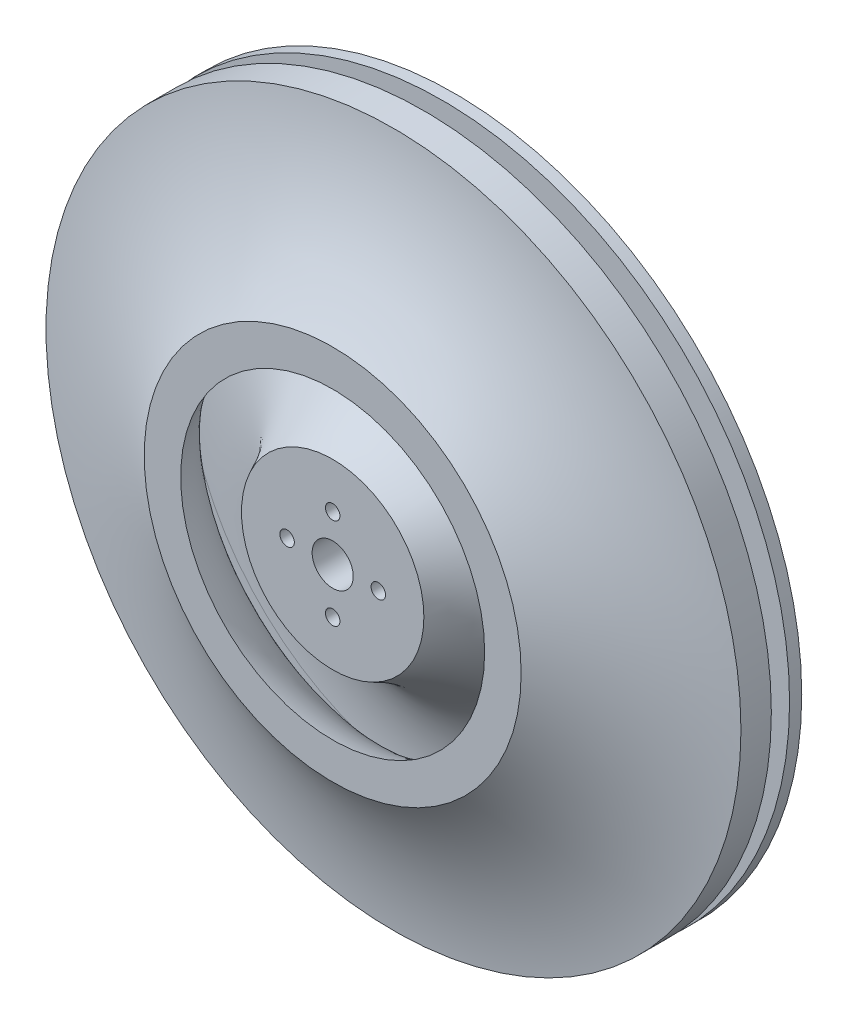
ISO-10303-21;
HEADER;
FILE_DESCRIPTION(('STEP AP214'),'2;1');
FILE_NAME('part.step','',(''),(''),'','','');
FILE_SCHEMA(('AUTOMOTIVE_DESIGN { 1 0 10303 214 1 1 1 1 }'));
ENDSEC;
DATA;
#1=APPLICATION_CONTEXT('core data for automotive mechanical design processes');
#2=APPLICATION_PROTOCOL_DEFINITION('international standard','automotive_design',2000,#1);
#3=PRODUCT_CONTEXT('',#1,'mechanical');
#4=PRODUCT('Part','Part','',(#3));
#5=PRODUCT_RELATED_PRODUCT_CATEGORY('part','',(#4));
#6=PRODUCT_DEFINITION_FORMATION('','',#4);
#7=PRODUCT_DEFINITION_CONTEXT('part definition',#1,'design');
#8=PRODUCT_DEFINITION('design','',#6,#7);
#9=PRODUCT_DEFINITION_SHAPE('','',#8);
#10=(LENGTH_UNIT() NAMED_UNIT(*) SI_UNIT(.MILLI.,.METRE.));
#11=(NAMED_UNIT(*) PLANE_ANGLE_UNIT() SI_UNIT($,.RADIAN.));
#12=(NAMED_UNIT(*) SI_UNIT($,.STERADIAN.) SOLID_ANGLE_UNIT());
#13=UNCERTAINTY_MEASURE_WITH_UNIT(LENGTH_MEASURE(1.E-05),#10,'distance_accuracy_value','');
#14=(GEOMETRIC_REPRESENTATION_CONTEXT(3) GLOBAL_UNCERTAINTY_ASSIGNED_CONTEXT((#13)) GLOBAL_UNIT_ASSIGNED_CONTEXT((#10,
#11,#12)) REPRESENTATION_CONTEXT('',''));
#15=CARTESIAN_POINT('',(0.,0.,0.));
#16=DIRECTION('',(0.,0.,1.));
#17=DIRECTION('',(1.,0.,0.));
#18=AXIS2_PLACEMENT_3D('',#15,#16,#17);
#19=CARTESIAN_POINT('',(0.,-57.15,2.));
#20=DIRECTION('',(0.,0.,-1.));
#21=DIRECTION('',(-1.,0.,0.));
#22=AXIS2_PLACEMENT_3D('',#19,#20,#21);
#23=PLANE('',#22);
#24=CARTESIAN_POINT('',(0.,0.,1.99999999999999));
#25=DIRECTION('',(0.,0.,1.));
#26=DIRECTION('',(1.,0.,0.));
#27=AXIS2_PLACEMENT_3D('',#24,#25,#26);
#28=CIRCLE('',#27,42.15);
#29=CARTESIAN_POINT('',(42.15,0.,1.99999999999999));
#30=VERTEX_POINT('',#29);
#31=EDGE_CURVE('E11',#30,#30,#28,.T.);
#32=ORIENTED_EDGE('',*,*,#31,.F.);
#33=EDGE_LOOP('',(#32));
#34=FACE_BOUND('',#33,.T.);
#35=CARTESIAN_POINT('',(0.,0.,1.99999999999999));
#36=DIRECTION('',(0.,0.,1.));
#37=DIRECTION('',(1.,0.,0.));
#38=AXIS2_PLACEMENT_3D('',#35,#36,#37);
#39=CIRCLE('',#38,57.15);
#40=CARTESIAN_POINT('',(57.15,0.,1.99999999999999));
#41=VERTEX_POINT('',#40);
#42=EDGE_CURVE('E117',#41,#41,#39,.T.);
#43=ORIENTED_EDGE('',*,*,#42,.T.);
#44=EDGE_LOOP('',(#43));
#45=FACE_BOUND('',#44,.T.);
#46=ADVANCED_FACE('F50',(#34,#45),#23,.F.);
#47=CARTESIAN_POINT('',(0.,0.,21.));
#48=DIRECTION('',(0.,0.,1.));
#49=DIRECTION('',(1.,0.,0.));
#50=AXIS2_PLACEMENT_3D('',#47,#48,#49);
#51=CYLINDRICAL_SURFACE('',#50,57.15);
#52=ORIENTED_EDGE('',*,*,#42,.F.);
#53=EDGE_LOOP('',(#52));
#54=FACE_BOUND('',#53,.T.);
#55=CARTESIAN_POINT('',(0.,0.,0.));
#56=DIRECTION('',(0.,0.,1.));
#57=DIRECTION('',(1.,0.,0.));
#58=AXIS2_PLACEMENT_3D('',#55,#56,#57);
#59=CIRCLE('',#58,57.15);
#60=CARTESIAN_POINT('',(57.15,0.,0.));
#61=VERTEX_POINT('',#60);
#62=EDGE_CURVE('E113',#61,#61,#59,.T.);
#63=ORIENTED_EDGE('',*,*,#62,.T.);
#64=EDGE_LOOP('',(#63));
#65=FACE_BOUND('',#64,.T.);
#66=ADVANCED_FACE('F191',(#54,#65),#51,.T.);
#67=CARTESIAN_POINT('',(0.,-39.525,0.));
#68=DIRECTION('',(0.,0.,1.));
#69=DIRECTION('',(1.,0.,0.));
#70=AXIS2_PLACEMENT_3D('',#67,#68,#69);
#71=PLANE('',#70);
#72=ORIENTED_EDGE('',*,*,#62,.F.);
#73=EDGE_LOOP('',(#72));
#74=FACE_BOUND('',#73,.T.);
#75=CARTESIAN_POINT('',(0.,0.,0.));
#76=DIRECTION('',(0.,0.,1.));
#77=DIRECTION('',(1.,0.,0.));
#78=AXIS2_PLACEMENT_3D('',#75,#76,#77);
#79=CIRCLE('',#78,39.525);
#80=CARTESIAN_POINT('',(39.525,0.,0.));
#81=VERTEX_POINT('',#80);
#82=EDGE_CURVE('E115',#81,#81,#79,.T.);
#83=ORIENTED_EDGE('',*,*,#82,.T.);
#84=EDGE_LOOP('',(#83));
#85=FACE_BOUND('',#84,.T.);
#86=ADVANCED_FACE('F199',(#74,#85),#71,.F.);
#87=CARTESIAN_POINT('',(0.,0.,21.));
#88=DIRECTION('',(0.,0.,1.));
#89=DIRECTION('',(1.,0.,0.));
#90=AXIS2_PLACEMENT_3D('',#87,#88,#89);
#91=CYLINDRICAL_SURFACE('',#90,39.525);
#92=ORIENTED_EDGE('',*,*,#82,.F.);
#93=EDGE_LOOP('',(#92));
#94=FACE_BOUND('',#93,.T.);
#95=CARTESIAN_POINT('',(0.,0.,1.));
#96=DIRECTION('',(0.,0.,1.));
#97=DIRECTION('',(1.,0.,0.));
#98=AXIS2_PLACEMENT_3D('',#95,#96,#97);
#99=CIRCLE('',#98,39.525);
#100=CARTESIAN_POINT('',(39.525,0.,1.));
#101=VERTEX_POINT('',#100);
#102=EDGE_CURVE('E108',#101,#101,#99,.T.);
#103=ORIENTED_EDGE('',*,*,#102,.T.);
#104=EDGE_LOOP('',(#103));
#105=FACE_BOUND('',#104,.T.);
#106=ADVANCED_FACE('F208',(#94,#105),#91,.F.);
#107=CARTESIAN_POINT('',(0.,-37.275,1.));
#108=DIRECTION('',(0.,0.,1.));
#109=DIRECTION('',(1.,0.,0.));
#110=AXIS2_PLACEMENT_3D('',#107,#108,#109);
#111=PLANE('',#110);
#112=ORIENTED_EDGE('',*,*,#102,.F.);
#113=EDGE_LOOP('',(#112));
#114=FACE_BOUND('',#113,.T.);
#115=CARTESIAN_POINT('',(0.,0.,1.));
#116=DIRECTION('',(0.,0.,1.));
#117=DIRECTION('',(1.,0.,0.));
#118=AXIS2_PLACEMENT_3D('',#115,#116,#117);
#119=CIRCLE('',#118,37.275);
#120=CARTESIAN_POINT('',(37.275,0.,1.));
#121=VERTEX_POINT('',#120);
#122=EDGE_CURVE('E106',#121,#121,#119,.T.);
#123=ORIENTED_EDGE('',*,*,#122,.T.);
#124=EDGE_LOOP('',(#123));
#125=FACE_BOUND('',#124,.T.);
#126=ADVANCED_FACE('F215',(#114,#125),#111,.F.);
#127=CARTESIAN_POINT('',(0.,0.,21.));
#128=DIRECTION('',(0.,0.,1.));
#129=DIRECTION('',(1.,0.,0.));
#130=AXIS2_PLACEMENT_3D('',#127,#128,#129);
#131=CYLINDRICAL_SURFACE('',#130,37.275);
#132=ORIENTED_EDGE('',*,*,#122,.F.);
#133=EDGE_LOOP('',(#132));
#134=FACE_BOUND('',#133,.T.);
#135=CARTESIAN_POINT('',(0.,0.,0.));
#136=DIRECTION('',(0.,0.,1.));
#137=DIRECTION('',(1.,0.,0.));
#138=AXIS2_PLACEMENT_3D('',#135,#136,#137);
#139=CIRCLE('',#138,37.275);
#140=CARTESIAN_POINT('',(37.275,0.,0.));
#141=VERTEX_POINT('',#140);
#142=EDGE_CURVE('E103',#141,#141,#139,.T.);
#143=ORIENTED_EDGE('',*,*,#142,.T.);
#144=EDGE_LOOP('',(#143));
#145=FACE_BOUND('',#144,.T.);
#146=ADVANCED_FACE('F216',(#134,#145),#131,.T.);
#147=CARTESIAN_POINT('',(0.,-35.525,0.));
#148=DIRECTION('',(0.,0.,1.));
#149=DIRECTION('',(1.,0.,0.));
#150=AXIS2_PLACEMENT_3D('',#147,#148,#149);
#151=PLANE('',#150);
#152=ORIENTED_EDGE('',*,*,#142,.F.);
#153=EDGE_LOOP('',(#152));
#154=FACE_BOUND('',#153,.T.);
#155=CARTESIAN_POINT('',(0.,0.,0.));
#156=DIRECTION('',(0.,0.,1.));
#157=DIRECTION('',(1.,0.,0.));
#158=AXIS2_PLACEMENT_3D('',#155,#156,#157);
#159=CIRCLE('',#158,35.525);
#160=CARTESIAN_POINT('',(35.525,0.,0.));
#161=VERTEX_POINT('',#160);
#162=EDGE_CURVE('E99',#161,#161,#159,.T.);
#163=ORIENTED_EDGE('',*,*,#162,.T.);
#164=EDGE_LOOP('',(#163));
#165=FACE_BOUND('',#164,.T.);
#166=ADVANCED_FACE('F219',(#154,#165),#151,.F.);
#167=CARTESIAN_POINT('',(0.,0.,21.));
#168=DIRECTION('',(0.,0.,1.));
#169=DIRECTION('',(1.,0.,0.));
#170=AXIS2_PLACEMENT_3D('',#167,#168,#169);
#171=CYLINDRICAL_SURFACE('',#170,35.525);
#172=ORIENTED_EDGE('',*,*,#162,.F.);
#173=EDGE_LOOP('',(#172));
#174=FACE_BOUND('',#173,.T.);
#175=CARTESIAN_POINT('',(0.,0.,1.));
#176=DIRECTION('',(0.,0.,1.));
#177=DIRECTION('',(1.,0.,0.));
#178=AXIS2_PLACEMENT_3D('',#175,#176,#177);
#179=CIRCLE('',#178,35.525);
#180=CARTESIAN_POINT('',(35.525,0.,1.));
#181=VERTEX_POINT('',#180);
#182=EDGE_CURVE('E100',#181,#181,#179,.T.);
#183=ORIENTED_EDGE('',*,*,#182,.T.);
#184=EDGE_LOOP('',(#183));
#185=FACE_BOUND('',#184,.T.);
#186=ADVANCED_FACE('F221',(#174,#185),#171,.F.);
#187=CARTESIAN_POINT('',(0.,-33.275,1.));
#188=DIRECTION('',(0.,0.,1.));
#189=DIRECTION('',(1.,0.,0.));
#190=AXIS2_PLACEMENT_3D('',#187,#188,#189);
#191=PLANE('',#190);
#192=ORIENTED_EDGE('',*,*,#182,.F.);
#193=EDGE_LOOP('',(#192));
#194=FACE_BOUND('',#193,.T.);
#195=CARTESIAN_POINT('',(0.,0.,1.));
#196=DIRECTION('',(0.,0.,1.));
#197=DIRECTION('',(1.,0.,0.));
#198=AXIS2_PLACEMENT_3D('',#195,#196,#197);
#199=CIRCLE('',#198,33.275);
#200=CARTESIAN_POINT('',(33.275,0.,1.));
#201=VERTEX_POINT('',#200);
#202=EDGE_CURVE('E94',#201,#201,#199,.T.);
#203=ORIENTED_EDGE('',*,*,#202,.T.);
#204=EDGE_LOOP('',(#203));
#205=FACE_BOUND('',#204,.T.);
#206=ADVANCED_FACE('F227',(#194,#205),#191,.F.);
#207=CARTESIAN_POINT('',(0.,0.,21.));
#208=DIRECTION('',(0.,0.,1.));
#209=DIRECTION('',(1.,0.,0.));
#210=AXIS2_PLACEMENT_3D('',#207,#208,#209);
#211=CYLINDRICAL_SURFACE('',#210,33.275);
#212=ORIENTED_EDGE('',*,*,#202,.F.);
#213=EDGE_LOOP('',(#212));
#214=FACE_BOUND('',#213,.T.);
#215=CARTESIAN_POINT('',(0.,0.,0.));
#216=DIRECTION('',(0.,0.,1.));
#217=DIRECTION('',(1.,0.,0.));
#218=AXIS2_PLACEMENT_3D('',#215,#216,#217);
#219=CIRCLE('',#218,33.275);
#220=CARTESIAN_POINT('',(33.275,0.,0.));
#221=VERTEX_POINT('',#220);
#222=EDGE_CURVE('E93',#221,#221,#219,.T.);
#223=ORIENTED_EDGE('',*,*,#222,.T.);
#224=EDGE_LOOP('',(#223));
#225=FACE_BOUND('',#224,.T.);
#226=ADVANCED_FACE('F234',(#214,#225),#211,.T.);
#227=CARTESIAN_POINT('',(0.,-31.525,0.));
#228=DIRECTION('',(0.,0.,1.));
#229=DIRECTION('',(1.,0.,0.));
#230=AXIS2_PLACEMENT_3D('',#227,#228,#229);
#231=PLANE('',#230);
#232=ORIENTED_EDGE('',*,*,#222,.F.);
#233=EDGE_LOOP('',(#232));
#234=FACE_BOUND('',#233,.T.);
#235=CARTESIAN_POINT('',(0.,0.,0.));
#236=DIRECTION('',(0.,0.,1.));
#237=DIRECTION('',(1.,0.,0.));
#238=AXIS2_PLACEMENT_3D('',#235,#236,#237);
#239=CIRCLE('',#238,31.525);
#240=CARTESIAN_POINT('',(31.525,0.,0.));
#241=VERTEX_POINT('',#240);
#242=EDGE_CURVE('E86',#241,#241,#239,.T.);
#243=ORIENTED_EDGE('',*,*,#242,.T.);
#244=EDGE_LOOP('',(#243));
#245=FACE_BOUND('',#244,.T.);
#246=ADVANCED_FACE('F237',(#234,#245),#231,.F.);
#247=CARTESIAN_POINT('',(0.,0.,21.));
#248=DIRECTION('',(0.,0.,1.));
#249=DIRECTION('',(1.,0.,0.));
#250=AXIS2_PLACEMENT_3D('',#247,#248,#249);
#251=CYLINDRICAL_SURFACE('',#250,31.525);
#252=ORIENTED_EDGE('',*,*,#242,.F.);
#253=EDGE_LOOP('',(#252));
#254=FACE_BOUND('',#253,.T.);
#255=CARTESIAN_POINT('',(0.,0.,1.));
#256=DIRECTION('',(0.,0.,1.));
#257=DIRECTION('',(1.,0.,0.));
#258=AXIS2_PLACEMENT_3D('',#255,#256,#257);
#259=CIRCLE('',#258,31.525);
#260=CARTESIAN_POINT('',(31.525,0.,1.));
#261=VERTEX_POINT('',#260);
#262=EDGE_CURVE('E83',#261,#261,#259,.T.);
#263=ORIENTED_EDGE('',*,*,#262,.T.);
#264=EDGE_LOOP('',(#263));
#265=FACE_BOUND('',#264,.T.);
#266=ADVANCED_FACE('F238',(#254,#265),#251,.F.);
#267=CARTESIAN_POINT('',(0.,-29.275,1.));
#268=DIRECTION('',(0.,0.,1.));
#269=DIRECTION('',(1.,0.,0.));
#270=AXIS2_PLACEMENT_3D('',#267,#268,#269);
#271=PLANE('',#270);
#272=ORIENTED_EDGE('',*,*,#262,.F.);
#273=EDGE_LOOP('',(#272));
#274=FACE_BOUND('',#273,.T.);
#275=CARTESIAN_POINT('',(0.,0.,1.));
#276=DIRECTION('',(0.,0.,1.));
#277=DIRECTION('',(1.,0.,0.));
#278=AXIS2_PLACEMENT_3D('',#275,#276,#277);
#279=CIRCLE('',#278,29.275);
#280=CARTESIAN_POINT('',(29.275,0.,1.));
#281=VERTEX_POINT('',#280);
#282=EDGE_CURVE('E84',#281,#281,#279,.T.);
#283=ORIENTED_EDGE('',*,*,#282,.T.);
#284=EDGE_LOOP('',(#283));
#285=FACE_BOUND('',#284,.T.);
#286=ADVANCED_FACE('F245',(#274,#285),#271,.F.);
#287=CARTESIAN_POINT('',(0.,0.,21.));
#288=DIRECTION('',(0.,0.,1.));
#289=DIRECTION('',(1.,0.,0.));
#290=AXIS2_PLACEMENT_3D('',#287,#288,#289);
#291=CYLINDRICAL_SURFACE('',#290,29.275);
#292=ORIENTED_EDGE('',*,*,#282,.F.);
#293=EDGE_LOOP('',(#292));
#294=FACE_BOUND('',#293,.T.);
#295=CARTESIAN_POINT('',(0.,0.,0.));
#296=DIRECTION('',(0.,0.,1.));
#297=DIRECTION('',(1.,0.,0.));
#298=AXIS2_PLACEMENT_3D('',#295,#296,#297);
#299=CIRCLE('',#298,29.275);
#300=CARTESIAN_POINT('',(29.275,0.,0.));
#301=VERTEX_POINT('',#300);
#302=EDGE_CURVE('E80',#301,#301,#299,.T.);
#303=ORIENTED_EDGE('',*,*,#302,.T.);
#304=EDGE_LOOP('',(#303));
#305=FACE_BOUND('',#304,.T.);
#306=ADVANCED_FACE('F250',(#294,#305),#291,.T.);
#307=CARTESIAN_POINT('',(0.,-27.525,0.));
#308=DIRECTION('',(0.,0.,1.));
#309=DIRECTION('',(1.,0.,0.));
#310=AXIS2_PLACEMENT_3D('',#307,#308,#309);
#311=PLANE('',#310);
#312=ORIENTED_EDGE('',*,*,#302,.F.);
#313=EDGE_LOOP('',(#312));
#314=FACE_BOUND('',#313,.T.);
#315=CARTESIAN_POINT('',(0.,0.,0.));
#316=DIRECTION('',(0.,0.,1.));
#317=DIRECTION('',(1.,0.,0.));
#318=AXIS2_PLACEMENT_3D('',#315,#316,#317);
#319=CIRCLE('',#318,27.525);
#320=CARTESIAN_POINT('',(27.525,0.,0.));
#321=VERTEX_POINT('',#320);
#322=EDGE_CURVE('E78',#321,#321,#319,.T.);
#323=ORIENTED_EDGE('',*,*,#322,.T.);
#324=EDGE_LOOP('',(#323));
#325=FACE_BOUND('',#324,.T.);
#326=ADVANCED_FACE('F252',(#314,#325),#311,.F.);
#327=CARTESIAN_POINT('',(0.,0.,21.));
#328=DIRECTION('',(0.,0.,1.));
#329=DIRECTION('',(1.,0.,0.));
#330=AXIS2_PLACEMENT_3D('',#327,#328,#329);
#331=CYLINDRICAL_SURFACE('',#330,27.525);
#332=ORIENTED_EDGE('',*,*,#322,.F.);
#333=EDGE_LOOP('',(#332));
#334=FACE_BOUND('',#333,.T.);
#335=CARTESIAN_POINT('',(0.,0.,1.));
#336=DIRECTION('',(0.,0.,1.));
#337=DIRECTION('',(1.,0.,0.));
#338=AXIS2_PLACEMENT_3D('',#335,#336,#337);
#339=CIRCLE('',#338,27.525);
#340=CARTESIAN_POINT('',(27.525,0.,1.));
#341=VERTEX_POINT('',#340);
#342=EDGE_CURVE('E71',#341,#341,#339,.T.);
#343=ORIENTED_EDGE('',*,*,#342,.T.);
#344=EDGE_LOOP('',(#343));
#345=FACE_BOUND('',#344,.T.);
#346=ADVANCED_FACE('F258',(#334,#345),#331,.F.);
#347=CARTESIAN_POINT('',(0.,-25.275,1.));
#348=DIRECTION('',(0.,0.,1.));
#349=DIRECTION('',(1.,0.,0.));
#350=AXIS2_PLACEMENT_3D('',#347,#348,#349);
#351=PLANE('',#350);
#352=ORIENTED_EDGE('',*,*,#342,.F.);
#353=EDGE_LOOP('',(#352));
#354=FACE_BOUND('',#353,.T.);
#355=CARTESIAN_POINT('',(0.,0.,1.));
#356=DIRECTION('',(0.,0.,1.));
#357=DIRECTION('',(1.,0.,0.));
#358=AXIS2_PLACEMENT_3D('',#355,#356,#357);
#359=CIRCLE('',#358,25.275);
#360=CARTESIAN_POINT('',(25.275,0.,1.));
#361=VERTEX_POINT('',#360);
#362=EDGE_CURVE('E68',#361,#361,#359,.T.);
#363=ORIENTED_EDGE('',*,*,#362,.T.);
#364=EDGE_LOOP('',(#363));
#365=FACE_BOUND('',#364,.T.);
#366=ADVANCED_FACE('F257',(#354,#365),#351,.F.);
#367=CARTESIAN_POINT('',(0.,0.,21.));
#368=DIRECTION('',(0.,0.,1.));
#369=DIRECTION('',(1.,0.,0.));
#370=AXIS2_PLACEMENT_3D('',#367,#368,#369);
#371=CYLINDRICAL_SURFACE('',#370,25.275);
#372=ORIENTED_EDGE('',*,*,#362,.F.);
#373=EDGE_LOOP('',(#372));
#374=FACE_BOUND('',#373,.T.);
#375=CARTESIAN_POINT('',(0.,0.,0.));
#376=DIRECTION('',(0.,0.,1.));
#377=DIRECTION('',(1.,0.,0.));
#378=AXIS2_PLACEMENT_3D('',#375,#376,#377);
#379=CIRCLE('',#378,25.275);
#380=CARTESIAN_POINT('',(25.275,0.,0.));
#381=VERTEX_POINT('',#380);
#382=EDGE_CURVE('E69',#381,#381,#379,.T.);
#383=ORIENTED_EDGE('',*,*,#382,.T.);
#384=EDGE_LOOP('',(#383));
#385=FACE_BOUND('',#384,.T.);
#386=ADVANCED_FACE('F190',(#374,#385),#371,.T.);
#387=CARTESIAN_POINT('',(0.,-25.275,0.));
#388=DIRECTION('',(0.,0.,-1.));
#389=DIRECTION('',(-1.,0.,0.));
#390=AXIS2_PLACEMENT_3D('',#387,#388,#389);
#391=PLANE('',#390);
#392=CARTESIAN_POINT('',(0.,0.,0.));
#393=DIRECTION('',(0.,0.,1.));
#394=DIRECTION('',(1.,0.,0.));
#395=AXIS2_PLACEMENT_3D('',#392,#393,#394);
#396=CIRCLE('',#395,15.);
#397=CARTESIAN_POINT('',(15.,0.,0.));
#398=VERTEX_POINT('',#397);
#399=EDGE_CURVE('E64',#398,#398,#396,.T.);
#400=ORIENTED_EDGE('',*,*,#399,.T.);
#401=EDGE_LOOP('',(#400));
#402=FACE_BOUND('',#401,.T.);
#403=ORIENTED_EDGE('',*,*,#382,.F.);
#404=EDGE_LOOP('',(#403));
#405=FACE_BOUND('',#404,.T.);
#406=ADVANCED_FACE('F185',(#402,#405),#391,.T.);
#407=CARTESIAN_POINT('',(0.,0.,21.));
#408=DIRECTION('',(0.,0.,1.));
#409=DIRECTION('',(1.,0.,0.));
#410=AXIS2_PLACEMENT_3D('',#407,#408,#409);
#411=CYLINDRICAL_SURFACE('',#410,15.);
#412=ORIENTED_EDGE('',*,*,#399,.F.);
#413=EDGE_LOOP('',(#412));
#414=FACE_BOUND('',#413,.T.);
#415=CARTESIAN_POINT('',(0.,0.,5.));
#416=DIRECTION('',(0.,0.,1.));
#417=DIRECTION('',(1.,0.,0.));
#418=AXIS2_PLACEMENT_3D('',#415,#416,#417);
#419=CIRCLE('',#418,15.);
#420=CARTESIAN_POINT('',(15.,0.,5.));
#421=VERTEX_POINT('',#420);
#422=EDGE_CURVE('E59',#421,#421,#419,.T.);
#423=ORIENTED_EDGE('',*,*,#422,.T.);
#424=EDGE_LOOP('',(#423));
#425=FACE_BOUND('',#424,.T.);
#426=ADVANCED_FACE('F177',(#414,#425),#411,.F.);
#427=CARTESIAN_POINT('',(0.,0.,5.));
#428=DIRECTION('',(0.,0.,1.));
#429=DIRECTION('',(1.,0.,0.));
#430=AXIS2_PLACEMENT_3D('',#427,#428,#429);
#431=PLANE('',#430);
#432=CARTESIAN_POINT('',(0.,-7.5,5.));
#433=DIRECTION('',(0.,0.,1.));
#434=DIRECTION('',(1.,0.,0.));
#435=AXIS2_PLACEMENT_3D('',#432,#433,#434);
#436=CIRCLE('',#435,1.190625);
#437=CARTESIAN_POINT('',(1.190625,-7.5,5.));
#438=VERTEX_POINT('',#437);
#439=EDGE_CURVE('E122',#438,#438,#436,.F.);
#440=ORIENTED_EDGE('',*,*,#439,.F.);
#441=EDGE_LOOP('',(#440));
#442=FACE_BOUND('',#441,.T.);
#443=CARTESIAN_POINT('',(0.,0.,5.));
#444=DIRECTION('',(0.,0.,1.));
#445=DIRECTION('',(1.,0.,0.));
#446=AXIS2_PLACEMENT_3D('',#443,#444,#445);
#447=CIRCLE('',#446,3.3782);
#448=CARTESIAN_POINT('',(3.3782,0.,5.));
#449=VERTEX_POINT('',#448);
#450=EDGE_CURVE('E121',#449,#449,#447,.F.);
#451=ORIENTED_EDGE('',*,*,#450,.F.);
#452=EDGE_LOOP('',(#451));
#453=FACE_BOUND('',#452,.T.);
#454=CARTESIAN_POINT('',(7.5,0.,5.));
#455=DIRECTION('',(0.,0.,1.));
#456=DIRECTION('',(1.,0.,0.));
#457=AXIS2_PLACEMENT_3D('',#454,#455,#456);
#458=CIRCLE('',#457,1.190625);
#459=CARTESIAN_POINT('',(8.690625,0.,5.));
#460=VERTEX_POINT('',#459);
#461=EDGE_CURVE('E130',#460,#460,#458,.F.);
#462=ORIENTED_EDGE('',*,*,#461,.F.);
#463=EDGE_LOOP('',(#462));
#464=FACE_BOUND('',#463,.T.);
#465=CARTESIAN_POINT('',(0.,7.5,5.));
#466=DIRECTION('',(0.,0.,1.));
#467=DIRECTION('',(1.,0.,0.));
#468=AXIS2_PLACEMENT_3D('',#465,#466,#467);
#469=CIRCLE('',#468,1.190625);
#470=CARTESIAN_POINT('',(1.190625,7.5,5.));
#471=VERTEX_POINT('',#470);
#472=EDGE_CURVE('E128',#471,#471,#469,.F.);
#473=ORIENTED_EDGE('',*,*,#472,.F.);
#474=EDGE_LOOP('',(#473));
#475=FACE_BOUND('',#474,.T.);
#476=CARTESIAN_POINT('',(-7.5,0.,5.));
#477=DIRECTION('',(0.,0.,1.));
#478=DIRECTION('',(1.,0.,0.));
#479=AXIS2_PLACEMENT_3D('',#476,#477,#478);
#480=CIRCLE('',#479,1.190625);
#481=CARTESIAN_POINT('',(-6.309375,0.,5.));
#482=VERTEX_POINT('',#481);
#483=EDGE_CURVE('E132',#482,#482,#480,.F.);
#484=ORIENTED_EDGE('',*,*,#483,.F.);
#485=EDGE_LOOP('',(#484));
#486=FACE_BOUND('',#485,.T.);
#487=ORIENTED_EDGE('',*,*,#422,.F.);
#488=EDGE_LOOP('',(#487));
#489=FACE_BOUND('',#488,.T.);
#490=ADVANCED_FACE('F158',(#442,#453,#464,#475,#486,#489),#431,.F.);
#491=CARTESIAN_POINT('',(0.,-15.,20.));
#492=DIRECTION('',(0.,0.,-1.));
#493=DIRECTION('',(-1.,0.,0.));
#494=AXIS2_PLACEMENT_3D('',#491,#492,#493);
#495=PLANE('',#494);
#496=CARTESIAN_POINT('',(0.,-7.5,20.));
#497=DIRECTION('',(0.,0.,1.));
#498=DIRECTION('',(1.,0.,0.));
#499=AXIS2_PLACEMENT_3D('',#496,#497,#498);
#500=CIRCLE('',#499,1.190625);
#501=CARTESIAN_POINT('',(1.190625,-7.5,20.));
#502=VERTEX_POINT('',#501);
#503=EDGE_CURVE('E137',#502,#502,#500,.T.);
#504=ORIENTED_EDGE('',*,*,#503,.F.);
#505=EDGE_LOOP('',(#504));
#506=FACE_BOUND('',#505,.T.);
#507=CARTESIAN_POINT('',(0.,0.,20.));
#508=DIRECTION('',(0.,0.,1.));
#509=DIRECTION('',(1.,0.,0.));
#510=AXIS2_PLACEMENT_3D('',#507,#508,#509);
#511=CIRCLE('',#510,3.3782);
#512=CARTESIAN_POINT('',(3.3782,0.,20.));
#513=VERTEX_POINT('',#512);
#514=EDGE_CURVE('E145',#513,#513,#511,.T.);
#515=ORIENTED_EDGE('',*,*,#514,.F.);
#516=EDGE_LOOP('',(#515));
#517=FACE_BOUND('',#516,.T.);
#518=CARTESIAN_POINT('',(7.5,0.,20.));
#519=DIRECTION('',(0.,0.,1.));
#520=DIRECTION('',(1.,0.,0.));
#521=AXIS2_PLACEMENT_3D('',#518,#519,#520);
#522=CIRCLE('',#521,1.190625);
#523=CARTESIAN_POINT('',(8.690625,0.,20.));
#524=VERTEX_POINT('',#523);
#525=EDGE_CURVE('E143',#524,#524,#522,.T.);
#526=ORIENTED_EDGE('',*,*,#525,.F.);
#527=EDGE_LOOP('',(#526));
#528=FACE_BOUND('',#527,.T.);
#529=CARTESIAN_POINT('',(0.,7.5,20.));
#530=DIRECTION('',(0.,0.,1.));
#531=DIRECTION('',(1.,0.,0.));
#532=AXIS2_PLACEMENT_3D('',#529,#530,#531);
#533=CIRCLE('',#532,1.190625);
#534=CARTESIAN_POINT('',(1.190625,7.5,20.));
#535=VERTEX_POINT('',#534);
#536=EDGE_CURVE('E139',#535,#535,#533,.T.);
#537=ORIENTED_EDGE('',*,*,#536,.F.);
#538=EDGE_LOOP('',(#537));
#539=FACE_BOUND('',#538,.T.);
#540=CARTESIAN_POINT('',(-7.5,0.,20.));
#541=DIRECTION('',(0.,0.,1.));
#542=DIRECTION('',(1.,0.,0.));
#543=AXIS2_PLACEMENT_3D('',#540,#541,#542);
#544=CIRCLE('',#543,1.190625);
#545=CARTESIAN_POINT('',(-6.309375,0.,20.));
#546=VERTEX_POINT('',#545);
#547=EDGE_CURVE('E138',#546,#546,#544,.T.);
#548=ORIENTED_EDGE('',*,*,#547,.F.);
#549=EDGE_LOOP('',(#548));
#550=FACE_BOUND('',#549,.T.);
#551=CARTESIAN_POINT('',(0.,0.,20.));
#552=DIRECTION('',(0.,0.,1.));
#553=DIRECTION('',(1.,0.,0.));
#554=AXIS2_PLACEMENT_3D('',#551,#552,#553);
#555=CIRCLE('',#554,15.);
#556=CARTESIAN_POINT('',(15.,0.,20.));
#557=VERTEX_POINT('',#556);
#558=EDGE_CURVE('E53',#557,#557,#555,.T.);
#559=ORIENTED_EDGE('',*,*,#558,.T.);
#560=EDGE_LOOP('',(#559));
#561=FACE_BOUND('',#560,.T.);
#562=ADVANCED_FACE('F154',(#506,#517,#528,#539,#550,#561),#495,.F.);
#563=CARTESIAN_POINT('',(0.,0.,31.475625));
#564=DIRECTION('',(0.,0.,1.));
#565=DIRECTION('',(1.,0.,0.));
#566=AXIS2_PLACEMENT_3D('',#563,#564,#565);
#567=TOROIDAL_SURFACE('',#566,42.15,29.475625);
#568=ORIENTED_EDGE('',*,*,#558,.F.);
#569=EDGE_LOOP('',(#568));
#570=FACE_BOUND('',#569,.T.);
#571=ORIENTED_EDGE('',*,*,#31,.T.);
#572=EDGE_LOOP('',(#571));
#573=FACE_BOUND('',#572,.T.);
#574=ADVANCED_FACE('F47',(#570,#573),#567,.F.);
#575=CARTESIAN_POINT('',(-7.5,0.,20.));
#576=DIRECTION('',(0.,0.,-1.));
#577=DIRECTION('',(-1.,0.,0.));
#578=AXIS2_PLACEMENT_3D('',#575,#576,#577);
#579=CYLINDRICAL_SURFACE('',#578,1.190625);
#580=ORIENTED_EDGE('',*,*,#547,.T.);
#581=EDGE_LOOP('',(#580));
#582=FACE_BOUND('',#581,.T.);
#583=ORIENTED_EDGE('',*,*,#483,.T.);
#584=EDGE_LOOP('',(#583));
#585=FACE_BOUND('',#584,.T.);
#586=ADVANCED_FACE('F170',(#582,#585),#579,.F.);
#587=CARTESIAN_POINT('',(0.,7.5,20.));
#588=DIRECTION('',(0.,0.,-1.));
#589=DIRECTION('',(-1.,0.,0.));
#590=AXIS2_PLACEMENT_3D('',#587,#588,#589);
#591=CYLINDRICAL_SURFACE('',#590,1.190625);
#592=ORIENTED_EDGE('',*,*,#536,.T.);
#593=EDGE_LOOP('',(#592));
#594=FACE_BOUND('',#593,.T.);
#595=ORIENTED_EDGE('',*,*,#472,.T.);
#596=EDGE_LOOP('',(#595));
#597=FACE_BOUND('',#596,.T.);
#598=ADVANCED_FACE('F168',(#594,#597),#591,.F.);
#599=CARTESIAN_POINT('',(7.5,0.,20.));
#600=DIRECTION('',(0.,0.,-1.));
#601=DIRECTION('',(-1.,0.,0.));
#602=AXIS2_PLACEMENT_3D('',#599,#600,#601);
#603=CYLINDRICAL_SURFACE('',#602,1.190625);
#604=ORIENTED_EDGE('',*,*,#525,.T.);
#605=EDGE_LOOP('',(#604));
#606=FACE_BOUND('',#605,.T.);
#607=ORIENTED_EDGE('',*,*,#461,.T.);
#608=EDGE_LOOP('',(#607));
#609=FACE_BOUND('',#608,.T.);
#610=ADVANCED_FACE('F319',(#606,#609),#603,.F.);
#611=CARTESIAN_POINT('',(0.,0.,20.));
#612=DIRECTION('',(0.,0.,-1.));
#613=DIRECTION('',(-1.,0.,0.));
#614=AXIS2_PLACEMENT_3D('',#611,#612,#613);
#615=CYLINDRICAL_SURFACE('',#614,3.3782);
#616=ORIENTED_EDGE('',*,*,#514,.T.);
#617=EDGE_LOOP('',(#616));
#618=FACE_BOUND('',#617,.T.);
#619=ORIENTED_EDGE('',*,*,#450,.T.);
#620=EDGE_LOOP('',(#619));
#621=FACE_BOUND('',#620,.T.);
#622=ADVANCED_FACE('F328',(#618,#621),#615,.F.);
#623=CARTESIAN_POINT('',(0.,-7.5,20.));
#624=DIRECTION('',(0.,0.,-1.));
#625=DIRECTION('',(-1.,0.,0.));
#626=AXIS2_PLACEMENT_3D('',#623,#624,#625);
#627=CYLINDRICAL_SURFACE('',#626,1.190625);
#628=ORIENTED_EDGE('',*,*,#503,.T.);
#629=EDGE_LOOP('',(#628));
#630=FACE_BOUND('',#629,.T.);
#631=ORIENTED_EDGE('',*,*,#439,.T.);
#632=EDGE_LOOP('',(#631));
#633=FACE_BOUND('',#632,.T.);
#634=ADVANCED_FACE('F155',(#630,#633),#627,.F.);
#635=CLOSED_SHELL('',(#46,#66,#86,#106,#126,#146,#166,#186,#206,#226,#246,#266,#286,#306,#326,
#346,#366,#386,#406,#426,#490,#562,#574,#586,#598,#610,#622,#634));
#636=MANIFOLD_SOLID_BREP('B2',#635);
#637=CARTESIAN_POINT('',(0.,0.,64.6801284490109));
#638=DIRECTION('',(0.,0.,1.));
#639=DIRECTION('',(1.,0.,0.));
#640=AXIS2_PLACEMENT_3D('',#637,#638,#639);
#641=TOROIDAL_SURFACE('',#640,63.0731370741916,55.);
#642=CARTESIAN_POINT('',(0.,0.,20.));
#643=DIRECTION('',(0.,0.,1.));
#644=DIRECTION('',(1.,0.,0.));
#645=AXIS2_PLACEMENT_3D('',#642,#643,#644);
#646=CIRCLE('',#645,31.);
#647=CARTESIAN_POINT('',(31.,0.,20.));
#648=VERTEX_POINT('',#647);
#649=EDGE_CURVE('E515',#648,#648,#646,.T.);
#650=ORIENTED_EDGE('',*,*,#649,.F.);
#651=EDGE_LOOP('',(#650));
#652=FACE_BOUND('',#651,.T.);
#653=CARTESIAN_POINT('',(0.,0.,10.));
#654=DIRECTION('',(0.,0.,1.));
#655=DIRECTION('',(1.,0.,0.));
#656=AXIS2_PLACEMENT_3D('',#653,#654,#655);
#657=CIRCLE('',#656,57.15);
#658=CARTESIAN_POINT('',(57.15,0.,10.));
#659=VERTEX_POINT('',#658);
#660=EDGE_CURVE('E46',#659,#659,#657,.T.);
#661=ORIENTED_EDGE('',*,*,#660,.T.);
#662=EDGE_LOOP('',(#661));
#663=FACE_BOUND('',#662,.T.);
#664=ADVANCED_FACE('F492',(#652,#663),#641,.F.);
#665=CARTESIAN_POINT('',(0.,0.,21.));
#666=DIRECTION('',(0.,0.,1.));
#667=DIRECTION('',(1.,0.,0.));
#668=AXIS2_PLACEMENT_3D('',#665,#666,#667);
#669=CYLINDRICAL_SURFACE('',#668,57.15);
#670=CARTESIAN_POINT('',(0.,0.,5.));
#671=DIRECTION('',(0.,0.,1.));
#672=DIRECTION('',(1.,0.,0.));
#673=AXIS2_PLACEMENT_3D('',#670,#671,#672);
#674=CIRCLE('',#673,57.15);
#675=CARTESIAN_POINT('',(57.15,0.,5.));
#676=VERTEX_POINT('',#675);
#677=EDGE_CURVE('E496',#676,#676,#674,.T.);
#678=ORIENTED_EDGE('',*,*,#677,.T.);
#679=EDGE_LOOP('',(#678));
#680=FACE_BOUND('',#679,.T.);
#681=ORIENTED_EDGE('',*,*,#660,.F.);
#682=EDGE_LOOP('',(#681));
#683=FACE_BOUND('',#682,.T.);
#684=ADVANCED_FACE('F520',(#680,#683),#669,.T.);
#685=CARTESIAN_POINT('',(0.,0.,5.));
#686=DIRECTION('',(0.,0.,-1.));
#687=DIRECTION('',(-1.,0.,0.));
#688=AXIS2_PLACEMENT_3D('',#685,#686,#687);
#689=CONICAL_SURFACE('',#688,57.15,1.48352986419518);
#690=CARTESIAN_POINT('',(0.,0.,6.31232995288886));
#691=DIRECTION('',(0.,0.,1.));
#692=DIRECTION('',(1.,0.,0.));
#693=AXIS2_PLACEMENT_3D('',#690,#691,#692);
#694=CIRCLE('',#693,42.15);
#695=CARTESIAN_POINT('',(42.15,0.,6.31232995288886));
#696=VERTEX_POINT('',#695);
#697=EDGE_CURVE('E502',#696,#696,#694,.T.);
#698=ORIENTED_EDGE('',*,*,#697,.T.);
#699=EDGE_LOOP('',(#698));
#700=FACE_BOUND('',#699,.T.);
#701=ORIENTED_EDGE('',*,*,#677,.F.);
#702=EDGE_LOOP('',(#701));
#703=FACE_BOUND('',#702,.T.);
#704=ADVANCED_FACE('F525',(#700,#703),#689,.F.);
#705=CARTESIAN_POINT('',(0.,0.,26.0655649901158));
#706=DIRECTION('',(0.,0.,1.));
#707=DIRECTION('',(1.,0.,0.));
#708=AXIS2_PLACEMENT_3D('',#705,#706,#707);
#709=TOROIDAL_SURFACE('',#708,43.8781841337204,19.8286891860247);
#710=CARTESIAN_POINT('',(0.,0.,20.));
#711=DIRECTION('',(0.,0.,1.));
#712=DIRECTION('',(1.,0.,0.));
#713=AXIS2_PLACEMENT_3D('',#710,#711,#712);
#714=CIRCLE('',#713,25.);
#715=CARTESIAN_POINT('',(25.,0.,20.));
#716=VERTEX_POINT('',#715);
#717=EDGE_CURVE('E509',#716,#716,#714,.T.);
#718=ORIENTED_EDGE('',*,*,#717,.T.);
#719=EDGE_LOOP('',(#718));
#720=FACE_BOUND('',#719,.T.);
#721=ORIENTED_EDGE('',*,*,#697,.F.);
#722=EDGE_LOOP('',(#721));
#723=FACE_BOUND('',#722,.T.);
#724=ADVANCED_FACE('F527',(#720,#723),#709,.T.);
#725=CARTESIAN_POINT('',(0.,0.,20.));
#726=DIRECTION('',(0.,0.,-1.));
#727=DIRECTION('',(-1.,0.,0.));
#728=AXIS2_PLACEMENT_3D('',#725,#726,#727);
#729=PLANE('',#728);
#730=ORIENTED_EDGE('',*,*,#717,.F.);
#731=EDGE_LOOP('',(#730));
#732=FACE_BOUND('',#731,.T.);
#733=ORIENTED_EDGE('',*,*,#649,.T.);
#734=EDGE_LOOP('',(#733));
#735=FACE_BOUND('',#734,.T.);
#736=ADVANCED_FACE('F518',(#732,#735),#729,.F.);
#737=CLOSED_SHELL('',(#664,#684,#704,#724,#736));
#738=MANIFOLD_SOLID_BREP('B6',#737);
#739=ADVANCED_BREP_SHAPE_REPRESENTATION('',(#18,#636,#738),#14);
#740=SHAPE_DEFINITION_REPRESENTATION(#9,#739);
ENDSEC;
END-ISO-10303-21;
